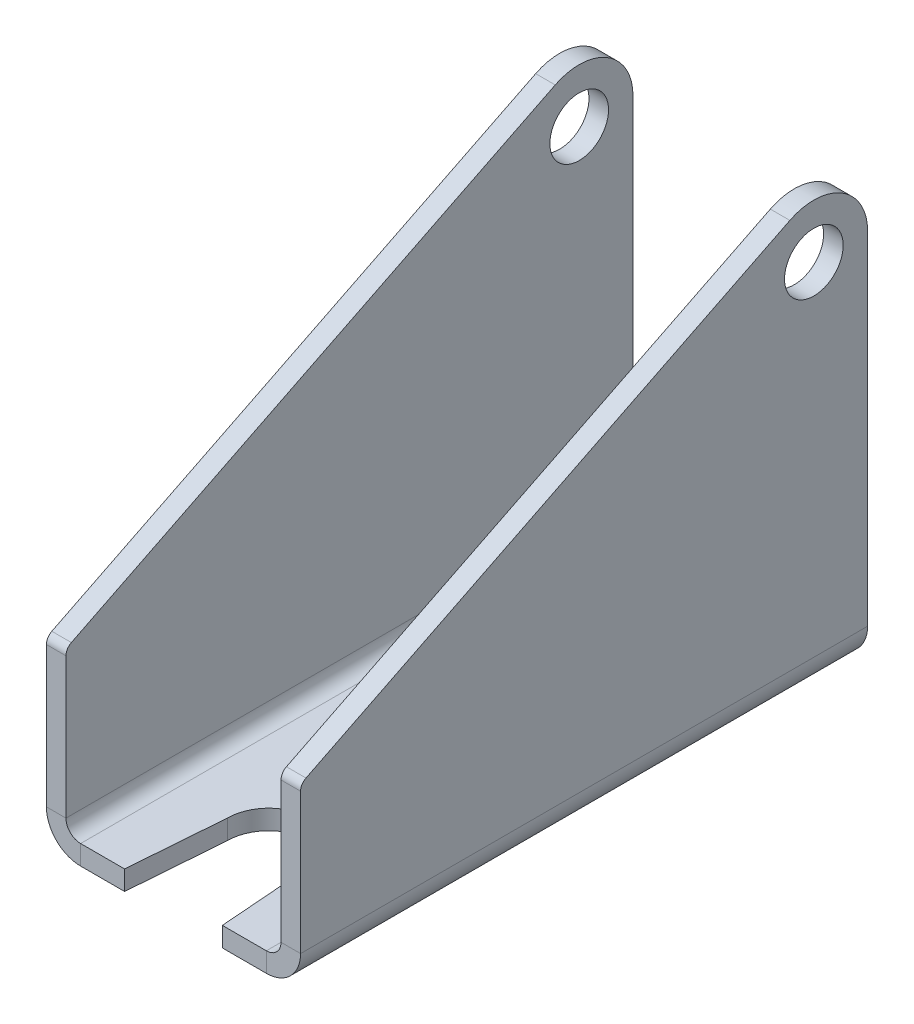
ISO-10303-21;
HEADER;
FILE_DESCRIPTION(('STEP AP214'),'2;1');
FILE_NAME('part.step','',(''),(''),'','','');
FILE_SCHEMA(('AUTOMOTIVE_DESIGN { 1 0 10303 214 1 1 1 1 }'));
ENDSEC;
DATA;
#1=APPLICATION_CONTEXT('core data for automotive mechanical design processes');
#2=APPLICATION_PROTOCOL_DEFINITION('international standard','automotive_design',2000,#1);
#3=PRODUCT_CONTEXT('',#1,'mechanical');
#4=PRODUCT('Part','Part','',(#3));
#5=PRODUCT_RELATED_PRODUCT_CATEGORY('part','',(#4));
#6=PRODUCT_DEFINITION_FORMATION('','',#4);
#7=PRODUCT_DEFINITION_CONTEXT('part definition',#1,'design');
#8=PRODUCT_DEFINITION('design','',#6,#7);
#9=PRODUCT_DEFINITION_SHAPE('','',#8);
#10=(LENGTH_UNIT() NAMED_UNIT(*) SI_UNIT(.MILLI.,.METRE.));
#11=(NAMED_UNIT(*) PLANE_ANGLE_UNIT() SI_UNIT($,.RADIAN.));
#12=(NAMED_UNIT(*) SI_UNIT($,.STERADIAN.) SOLID_ANGLE_UNIT());
#13=UNCERTAINTY_MEASURE_WITH_UNIT(LENGTH_MEASURE(1.E-05),#10,'distance_accuracy_value','');
#14=(GEOMETRIC_REPRESENTATION_CONTEXT(3) GLOBAL_UNCERTAINTY_ASSIGNED_CONTEXT((#13)) GLOBAL_UNIT_ASSIGNED_CONTEXT((#10,
#11,#12)) REPRESENTATION_CONTEXT('',''));
#15=CARTESIAN_POINT('',(0.,0.,0.));
#16=DIRECTION('',(0.,0.,1.));
#17=DIRECTION('',(1.,0.,0.));
#18=AXIS2_PLACEMENT_3D('',#15,#16,#17);
#19=CARTESIAN_POINT('',(0.,-2.,0.));
#20=DIRECTION('',(0.,0.,1.));
#21=DIRECTION('',(1.,0.,0.));
#22=AXIS2_PLACEMENT_3D('',#19,#20,#21);
#23=PLANE('',#22);
#24=DIRECTION('',(0.,-1.,0.));
#25=VECTOR('',#24,1.);
#26=CARTESIAN_POINT('',(-16.,-2.,0.));
#27=LINE('',#26,#25);
#28=CARTESIAN_POINT('',(-16.,0.,0.));
#29=VERTEX_POINT('',#28);
#30=CARTESIAN_POINT('',(-16.,-2.,0.));
#31=VERTEX_POINT('',#30);
#32=EDGE_CURVE('E77',#29,#31,#27,.T.);
#33=ORIENTED_EDGE('',*,*,#32,.F.);
#34=DIRECTION('',(1.,0.,0.));
#35=VECTOR('',#34,1.);
#36=CARTESIAN_POINT('',(0.,0.,0.));
#37=LINE('',#36,#35);
#38=CARTESIAN_POINT('',(-20.5,0.,0.));
#39=VERTEX_POINT('',#38);
#40=EDGE_CURVE('E363',#39,#29,#37,.T.);
#41=ORIENTED_EDGE('',*,*,#40,.F.);
#42=DIRECTION('',(0.,-1.,0.));
#43=VECTOR('',#42,1.);
#44=CARTESIAN_POINT('',(-20.5,0.,0.));
#45=LINE('',#44,#43);
#46=CARTESIAN_POINT('',(-20.5,-2.,0.));
#47=VERTEX_POINT('',#46);
#48=EDGE_CURVE('E343',#39,#47,#45,.T.);
#49=ORIENTED_EDGE('',*,*,#48,.T.);
#50=DIRECTION('',(1.,0.,0.));
#51=VECTOR('',#50,1.);
#52=CARTESIAN_POINT('',(-16.,-2.,0.));
#53=LINE('',#52,#51);
#54=EDGE_CURVE('E364',#47,#31,#53,.T.);
#55=ORIENTED_EDGE('',*,*,#54,.T.);
#56=EDGE_LOOP('',(#33,#41,#49,#55));
#57=FACE_BOUND('',#56,.T.);
#58=ADVANCED_FACE('F68',(#57),#23,.T.);
#59=CARTESIAN_POINT('',(-24.,0.,0.));
#60=DIRECTION('',(1.,0.,0.));
#61=DIRECTION('',(0.,1.,0.));
#62=AXIS2_PLACEMENT_3D('',#59,#60,#61);
#63=PLANE('',#62);
#64=CARTESIAN_POINT('',(-24.0000000000001,36.5,-52.5));
#65=DIRECTION('',(-1.,0.,0.));
#66=DIRECTION('',(0.,-1.,0.));
#67=AXIS2_PLACEMENT_3D('',#64,#65,#66);
#68=CIRCLE('',#67,3.);
#69=CARTESIAN_POINT('',(-24.0000000000001,33.5,-52.5));
#70=VERTEX_POINT('',#69);
#71=EDGE_CURVE('E236',#70,#70,#68,.T.);
#72=ORIENTED_EDGE('',*,*,#71,.F.);
#73=EDGE_LOOP('',(#72));
#74=FACE_BOUND('',#73,.T.);
#75=DIRECTION('',(0.,1.,0.));
#76=VECTOR('',#75,1.);
#77=CARTESIAN_POINT('',(-24.0000000000001,42.,0.));
#78=LINE('',#77,#76);
#79=CARTESIAN_POINT('',(-24.,1.49999999999999,0.));
#80=VERTEX_POINT('',#79);
#81=CARTESIAN_POINT('',(-24.0000000000001,15.8808509828625,0.));
#82=VERTEX_POINT('',#81);
#83=EDGE_CURVE('E326',#80,#82,#78,.T.);
#84=ORIENTED_EDGE('',*,*,#83,.T.);
#85=CARTESIAN_POINT('',(-24.0000000000001,15.8808509828624,-1.));
#86=DIRECTION('',(1.,0.,0.));
#87=DIRECTION('',(0.,1.,0.));
#88=AXIS2_PLACEMENT_3D('',#85,#86,#87);
#89=CIRCLE('',#88,1.);
#90=CARTESIAN_POINT('',(-24.0000000000001,16.7759983118712,-0.554229588949058));
#91=VERTEX_POINT('',#90);
#92=EDGE_CURVE('E380',#82,#91,#89,.F.);
#93=ORIENTED_EDGE('',*,*,#92,.T.);
#94=DIRECTION('',(0.,0.445770411050947,-0.895147329008734));
#95=VECTOR('',#94,1.);
#96=CARTESIAN_POINT('',(-24.,13.2212642204192,6.5839981812558));
#97=LINE('',#96,#95);
#98=CARTESIAN_POINT('',(-24.0000000000001,41.423310309548,-50.0482627392198));
#99=VERTEX_POINT('',#98);
#100=EDGE_CURVE('E251',#91,#99,#97,.T.);
#101=ORIENTED_EDGE('',*,*,#100,.T.);
#102=CARTESIAN_POINT('',(-24.0000000000001,36.5,-52.5));
#103=DIRECTION('',(-1.,0.,0.));
#104=DIRECTION('',(0.,-1.,0.));
#105=AXIS2_PLACEMENT_3D('',#102,#103,#104);
#106=CIRCLE('',#105,5.50000000000001);
#107=CARTESIAN_POINT('',(-24.0000000000001,36.5,-58.));
#108=VERTEX_POINT('',#107);
#109=EDGE_CURVE('E249',#99,#108,#106,.T.);
#110=ORIENTED_EDGE('',*,*,#109,.T.);
#111=DIRECTION('',(0.,-1.,0.));
#112=VECTOR('',#111,1.);
#113=CARTESIAN_POINT('',(-24.,0.,-58.));
#114=LINE('',#113,#112);
#115=CARTESIAN_POINT('',(-24.,1.49999999999999,-58.));
#116=VERTEX_POINT('',#115);
#117=EDGE_CURVE('E329',#108,#116,#114,.T.);
#118=ORIENTED_EDGE('',*,*,#117,.T.);
#119=DIRECTION('',(0.,0.,-1.));
#120=VECTOR('',#119,1.);
#121=CARTESIAN_POINT('',(-24.,1.49999999999999,0.));
#122=LINE('',#121,#120);
#123=EDGE_CURVE('E320',#80,#116,#122,.T.);
#124=ORIENTED_EDGE('',*,*,#123,.F.);
#125=EDGE_LOOP('',(#84,#93,#101,#110,#118,#124));
#126=FACE_BOUND('',#125,.T.);
#127=ADVANCED_FACE('F466',(#74,#126),#63,.F.);
#128=CARTESIAN_POINT('',(-22.,0.,0.));
#129=DIRECTION('',(1.,0.,0.));
#130=DIRECTION('',(0.,1.,0.));
#131=AXIS2_PLACEMENT_3D('',#128,#129,#130);
#132=PLANE('',#131);
#133=CARTESIAN_POINT('',(-22.0000000000001,36.5,-52.5));
#134=DIRECTION('',(1.,0.,0.));
#135=DIRECTION('',(0.,1.,0.));
#136=AXIS2_PLACEMENT_3D('',#133,#134,#135);
#137=CIRCLE('',#136,3.);
#138=CARTESIAN_POINT('',(-22.0000000000001,39.5,-52.5));
#139=VERTEX_POINT('',#138);
#140=EDGE_CURVE('E246',#139,#139,#137,.T.);
#141=ORIENTED_EDGE('',*,*,#140,.F.);
#142=EDGE_LOOP('',(#141));
#143=FACE_BOUND('',#142,.T.);
#144=DIRECTION('',(0.,-0.445770411050947,0.895147329008734));
#145=VECTOR('',#144,1.);
#146=CARTESIAN_POINT('',(-22.,13.2212642204192,6.5839981812558));
#147=LINE('',#146,#145);
#148=CARTESIAN_POINT('',(-22.0000000000001,41.423310309548,-50.0482627392198));
#149=VERTEX_POINT('',#148);
#150=CARTESIAN_POINT('',(-22.0000000000001,16.7759983118712,-0.554229588949059));
#151=VERTEX_POINT('',#150);
#152=EDGE_CURVE('E266',#149,#151,#147,.T.);
#153=ORIENTED_EDGE('',*,*,#152,.T.);
#154=CARTESIAN_POINT('',(-22.0000000000001,15.8808509828625,-1.));
#155=DIRECTION('',(1.,0.,0.));
#156=DIRECTION('',(0.,1.,0.));
#157=AXIS2_PLACEMENT_3D('',#154,#155,#156);
#158=CIRCLE('',#157,1.);
#159=CARTESIAN_POINT('',(-22.0000000000001,15.8808509828625,0.));
#160=VERTEX_POINT('',#159);
#161=EDGE_CURVE('E384',#151,#160,#158,.T.);
#162=ORIENTED_EDGE('',*,*,#161,.T.);
#163=DIRECTION('',(0.,1.,0.));
#164=VECTOR('',#163,1.);
#165=CARTESIAN_POINT('',(-22.0000000000001,42.,0.));
#166=LINE('',#165,#164);
#167=CARTESIAN_POINT('',(-22.,1.49999999999999,0.));
#168=VERTEX_POINT('',#167);
#169=EDGE_CURVE('E325',#168,#160,#166,.T.);
#170=ORIENTED_EDGE('',*,*,#169,.F.);
#171=DIRECTION('',(0.,0.,1.));
#172=VECTOR('',#171,1.);
#173=CARTESIAN_POINT('',(-22.,1.49999999999999,-58.));
#174=LINE('',#173,#172);
#175=CARTESIAN_POINT('',(-22.,1.49999999999999,-58.));
#176=VERTEX_POINT('',#175);
#177=EDGE_CURVE('E315',#176,#168,#174,.T.);
#178=ORIENTED_EDGE('',*,*,#177,.F.);
#179=DIRECTION('',(0.,-1.,0.));
#180=VECTOR('',#179,1.);
#181=CARTESIAN_POINT('',(-22.,0.,-58.));
#182=LINE('',#181,#180);
#183=CARTESIAN_POINT('',(-22.0000000000001,36.5,-58.));
#184=VERTEX_POINT('',#183);
#185=EDGE_CURVE('E330',#184,#176,#182,.T.);
#186=ORIENTED_EDGE('',*,*,#185,.F.);
#187=CARTESIAN_POINT('',(-22.0000000000001,36.5,-52.5));
#188=DIRECTION('',(1.,0.,0.));
#189=DIRECTION('',(0.,1.,0.));
#190=AXIS2_PLACEMENT_3D('',#187,#188,#189);
#191=CIRCLE('',#190,5.50000000000001);
#192=EDGE_CURVE('E261',#184,#149,#191,.T.);
#193=ORIENTED_EDGE('',*,*,#192,.T.);
#194=EDGE_LOOP('',(#153,#162,#170,#178,#186,#193));
#195=FACE_BOUND('',#194,.T.);
#196=ADVANCED_FACE('F455',(#143,#195),#132,.T.);
#197=CARTESIAN_POINT('',(2.,0.,0.));
#198=DIRECTION('',(-1.,0.,0.));
#199=DIRECTION('',(0.,-1.,0.));
#200=AXIS2_PLACEMENT_3D('',#197,#198,#199);
#201=PLANE('',#200);
#202=CARTESIAN_POINT('',(2.00000000000013,36.5000000000001,-52.5));
#203=DIRECTION('',(-1.,0.,0.));
#204=DIRECTION('',(0.,-1.,0.));
#205=AXIS2_PLACEMENT_3D('',#202,#203,#204);
#206=CIRCLE('',#205,3.);
#207=CARTESIAN_POINT('',(2.00000000000012,33.5000000000001,-52.5));
#208=VERTEX_POINT('',#207);
#209=EDGE_CURVE('E243',#208,#208,#206,.T.);
#210=ORIENTED_EDGE('',*,*,#209,.T.);
#211=EDGE_LOOP('',(#210));
#212=FACE_BOUND('',#211,.T.);
#213=DIRECTION('',(0.,0.445770411050947,-0.895147329008734));
#214=VECTOR('',#213,1.);
#215=CARTESIAN_POINT('',(2.00000000000005,13.2212642204193,6.5839981812558));
#216=LINE('',#215,#214);
#217=CARTESIAN_POINT('',(2.00000000000006,16.7759983118713,-0.554229588949056));
#218=VERTEX_POINT('',#217);
#219=CARTESIAN_POINT('',(2.0000000000001,41.4233103095481,-50.0482627392198));
#220=VERTEX_POINT('',#219);
#221=EDGE_CURVE('E264',#218,#220,#216,.T.);
#222=ORIENTED_EDGE('',*,*,#221,.F.);
#223=CARTESIAN_POINT('',(2.00000000000006,15.8808509828625,-1.));
#224=DIRECTION('',(-1.,0.,0.));
#225=DIRECTION('',(0.,-1.,0.));
#226=AXIS2_PLACEMENT_3D('',#223,#224,#225);
#227=CIRCLE('',#226,1.);
#228=CARTESIAN_POINT('',(2.00000000000006,15.8808509828625,0.));
#229=VERTEX_POINT('',#228);
#230=EDGE_CURVE('E392',#218,#229,#227,.F.);
#231=ORIENTED_EDGE('',*,*,#230,.T.);
#232=DIRECTION('',(0.,-1.,0.));
#233=VECTOR('',#232,1.);
#234=CARTESIAN_POINT('',(2.,0.,0.));
#235=LINE('',#234,#233);
#236=CARTESIAN_POINT('',(2.00000000000001,1.49999999999999,0.));
#237=VERTEX_POINT('',#236);
#238=EDGE_CURVE('E284',#229,#237,#235,.T.);
#239=ORIENTED_EDGE('',*,*,#238,.T.);
#240=DIRECTION('',(0.,0.,1.));
#241=VECTOR('',#240,1.);
#242=CARTESIAN_POINT('',(2.00000000000001,1.49999999999999,0.));
#243=LINE('',#242,#241);
#244=CARTESIAN_POINT('',(2.00000000000001,1.49999999999999,-58.));
#245=VERTEX_POINT('',#244);
#246=EDGE_CURVE('E275',#245,#237,#243,.T.);
#247=ORIENTED_EDGE('',*,*,#246,.F.);
#248=DIRECTION('',(0.,1.,0.));
#249=VECTOR('',#248,1.);
#250=CARTESIAN_POINT('',(2.00000000000015,42.,-58.));
#251=LINE('',#250,#249);
#252=CARTESIAN_POINT('',(2.00000000000007,36.5000000000001,-58.));
#253=VERTEX_POINT('',#252);
#254=EDGE_CURVE('E281',#245,#253,#251,.T.);
#255=ORIENTED_EDGE('',*,*,#254,.T.);
#256=CARTESIAN_POINT('',(2.00000000000013,36.5000000000001,-52.5));
#257=DIRECTION('',(-1.,0.,0.));
#258=DIRECTION('',(0.,-1.,0.));
#259=AXIS2_PLACEMENT_3D('',#256,#257,#258);
#260=CIRCLE('',#259,5.50000000000001);
#261=EDGE_CURVE('E259',#220,#253,#260,.T.);
#262=ORIENTED_EDGE('',*,*,#261,.F.);
#263=EDGE_LOOP('',(#222,#231,#239,#247,#255,#262));
#264=FACE_BOUND('',#263,.T.);
#265=ADVANCED_FACE('F433',(#212,#264),#201,.F.);
#266=CARTESIAN_POINT('',(0.,0.,0.));
#267=DIRECTION('',(-1.,0.,0.));
#268=DIRECTION('',(0.,-1.,0.));
#269=AXIS2_PLACEMENT_3D('',#266,#267,#268);
#270=PLANE('',#269);
#271=CARTESIAN_POINT('',(1.28369537222284E-13,36.5000000000001,-52.5));
#272=DIRECTION('',(-1.,0.,0.));
#273=DIRECTION('',(0.,-1.,0.));
#274=AXIS2_PLACEMENT_3D('',#271,#272,#273);
#275=CIRCLE('',#274,3.);
#276=CARTESIAN_POINT('',(1.17895093205754E-13,33.5000000000001,-52.5));
#277=VERTEX_POINT('',#276);
#278=EDGE_CURVE('E242',#277,#277,#275,.T.);
#279=ORIENTED_EDGE('',*,*,#278,.F.);
#280=EDGE_LOOP('',(#279));
#281=FACE_BOUND('',#280,.T.);
#282=DIRECTION('',(0.,-1.,0.));
#283=VECTOR('',#282,1.);
#284=CARTESIAN_POINT('',(0.,0.,0.));
#285=LINE('',#284,#283);
#286=CARTESIAN_POINT('',(0.,15.8808509828625,0.));
#287=VERTEX_POINT('',#286);
#288=CARTESIAN_POINT('',(0.,1.49999999999999,0.));
#289=VERTEX_POINT('',#288);
#290=EDGE_CURVE('E285',#287,#289,#285,.T.);
#291=ORIENTED_EDGE('',*,*,#290,.F.);
#292=CARTESIAN_POINT('',(0.,15.8808509828625,-1.));
#293=DIRECTION('',(-1.,0.,0.));
#294=DIRECTION('',(0.,-1.,0.));
#295=AXIS2_PLACEMENT_3D('',#292,#293,#294);
#296=CIRCLE('',#295,1.);
#297=CARTESIAN_POINT('',(0.,16.7759983118713,-0.554229588949056));
#298=VERTEX_POINT('',#297);
#299=EDGE_CURVE('E389',#287,#298,#296,.T.);
#300=ORIENTED_EDGE('',*,*,#299,.T.);
#301=DIRECTION('',(0.,0.445770411050947,-0.895147329008734));
#302=VECTOR('',#301,1.);
#303=CARTESIAN_POINT('',(0.,13.2212642204193,6.5839981812558));
#304=LINE('',#303,#302);
#305=CARTESIAN_POINT('',(1.00613961606655E-13,41.4233103095481,-50.0482627392198));
#306=VERTEX_POINT('',#305);
#307=EDGE_CURVE('E366',#298,#306,#304,.T.);
#308=ORIENTED_EDGE('',*,*,#307,.T.);
#309=CARTESIAN_POINT('',(1.28369537222284E-13,36.5000000000001,-52.5));
#310=DIRECTION('',(-1.,0.,0.));
#311=DIRECTION('',(0.,-1.,0.));
#312=AXIS2_PLACEMENT_3D('',#309,#310,#311);
#313=CIRCLE('',#312,5.50000000000001);
#314=CARTESIAN_POINT('',(0.,36.5000000000001,-58.));
#315=VERTEX_POINT('',#314);
#316=EDGE_CURVE('E257',#306,#315,#313,.T.);
#317=ORIENTED_EDGE('',*,*,#316,.T.);
#318=DIRECTION('',(0.,1.,0.));
#319=VECTOR('',#318,1.);
#320=CARTESIAN_POINT('',(1.46642216231412E-13,42.,-58.));
#321=LINE('',#320,#319);
#322=CARTESIAN_POINT('',(0.,1.49999999999999,-58.));
#323=VERTEX_POINT('',#322);
#324=EDGE_CURVE('E280',#323,#315,#321,.T.);
#325=ORIENTED_EDGE('',*,*,#324,.F.);
#326=DIRECTION('',(0.,0.,-1.));
#327=VECTOR('',#326,1.);
#328=CARTESIAN_POINT('',(0.,1.49999999999999,0.));
#329=LINE('',#328,#327);
#330=EDGE_CURVE('E270',#289,#323,#329,.T.);
#331=ORIENTED_EDGE('',*,*,#330,.F.);
#332=EDGE_LOOP('',(#291,#300,#308,#317,#325,#331));
#333=FACE_BOUND('',#332,.T.);
#334=ADVANCED_FACE('F420',(#281,#333),#270,.T.);
#335=CARTESIAN_POINT('',(-24.,0.,-58.));
#336=DIRECTION('',(0.,0.,1.));
#337=DIRECTION('',(1.,0.,0.));
#338=AXIS2_PLACEMENT_3D('',#335,#336,#337);
#339=PLANE('',#338);
#340=DIRECTION('',(-1.,0.,0.));
#341=VECTOR('',#340,1.);
#342=CARTESIAN_POINT('',(25.9999999999999,36.5000000000002,-58.));
#343=LINE('',#342,#341);
#344=EDGE_CURVE('E239',#184,#108,#343,.T.);
#345=ORIENTED_EDGE('',*,*,#344,.F.);
#346=ORIENTED_EDGE('',*,*,#185,.T.);
#347=DIRECTION('',(-1.,0.,0.));
#348=VECTOR('',#347,1.);
#349=CARTESIAN_POINT('',(-22.,1.49999999999999,-58.));
#350=LINE('',#349,#348);
#351=EDGE_CURVE('E312',#176,#116,#350,.T.);
#352=ORIENTED_EDGE('',*,*,#351,.T.);
#353=ORIENTED_EDGE('',*,*,#117,.F.);
#354=EDGE_LOOP('',(#345,#346,#352,#353));
#355=FACE_BOUND('',#354,.T.);
#356=ADVANCED_FACE('F483',(#355),#339,.F.);
#357=CARTESIAN_POINT('',(2.00000000000015,42.,-58.));
#358=DIRECTION('',(0.,0.,1.));
#359=DIRECTION('',(1.,0.,0.));
#360=AXIS2_PLACEMENT_3D('',#357,#358,#359);
#361=PLANE('',#360);
#362=DIRECTION('',(-1.,0.,0.));
#363=VECTOR('',#362,1.);
#364=CARTESIAN_POINT('',(25.9999999999999,36.5000000000002,-58.));
#365=LINE('',#364,#363);
#366=EDGE_CURVE('E372',#253,#315,#365,.T.);
#367=ORIENTED_EDGE('',*,*,#366,.F.);
#368=ORIENTED_EDGE('',*,*,#254,.F.);
#369=DIRECTION('',(1.,0.,0.));
#370=VECTOR('',#369,1.);
#371=CARTESIAN_POINT('',(0.,1.49999999999999,-58.));
#372=LINE('',#371,#370);
#373=EDGE_CURVE('E272',#323,#245,#372,.T.);
#374=ORIENTED_EDGE('',*,*,#373,.F.);
#375=ORIENTED_EDGE('',*,*,#324,.T.);
#376=EDGE_LOOP('',(#367,#368,#374,#375));
#377=FACE_BOUND('',#376,.T.);
#378=ADVANCED_FACE('F430',(#377),#361,.F.);
#379=CARTESIAN_POINT('',(-24.0000000000001,42.,0.));
#380=DIRECTION('',(0.,0.,-1.));
#381=DIRECTION('',(-1.,0.,0.));
#382=AXIS2_PLACEMENT_3D('',#379,#380,#381);
#383=PLANE('',#382);
#384=ORIENTED_EDGE('',*,*,#169,.T.);
#385=DIRECTION('',(-1.,0.,0.));
#386=VECTOR('',#385,1.);
#387=CARTESIAN_POINT('',(-24.0000000000001,15.8808509828624,0.));
#388=LINE('',#387,#386);
#389=EDGE_CURVE('E375',#160,#82,#388,.T.);
#390=ORIENTED_EDGE('',*,*,#389,.T.);
#391=ORIENTED_EDGE('',*,*,#83,.F.);
#392=DIRECTION('',(-1.,0.,0.));
#393=VECTOR('',#392,1.);
#394=CARTESIAN_POINT('',(-22.,1.49999999999999,0.));
#395=LINE('',#394,#393);
#396=EDGE_CURVE('E317',#168,#80,#395,.T.);
#397=ORIENTED_EDGE('',*,*,#396,.F.);
#398=EDGE_LOOP('',(#384,#390,#391,#397));
#399=FACE_BOUND('',#398,.T.);
#400=ADVANCED_FACE('F459',(#399),#383,.F.);
#401=CARTESIAN_POINT('',(2.,0.,0.));
#402=DIRECTION('',(0.,0.,-1.));
#403=DIRECTION('',(-1.,0.,0.));
#404=AXIS2_PLACEMENT_3D('',#401,#402,#403);
#405=PLANE('',#404);
#406=ORIENTED_EDGE('',*,*,#238,.F.);
#407=DIRECTION('',(-1.,0.,0.));
#408=VECTOR('',#407,1.);
#409=CARTESIAN_POINT('',(1.02782365951626E-13,15.8808509828625,0.));
#410=LINE('',#409,#408);
#411=EDGE_CURVE('E386',#229,#287,#410,.T.);
#412=ORIENTED_EDGE('',*,*,#411,.T.);
#413=ORIENTED_EDGE('',*,*,#290,.T.);
#414=DIRECTION('',(1.,0.,0.));
#415=VECTOR('',#414,1.);
#416=CARTESIAN_POINT('',(0.,1.49999999999999,0.));
#417=LINE('',#416,#415);
#418=EDGE_CURVE('E269',#289,#237,#417,.T.);
#419=ORIENTED_EDGE('',*,*,#418,.T.);
#420=EDGE_LOOP('',(#406,#412,#413,#419));
#421=FACE_BOUND('',#420,.T.);
#422=ADVANCED_FACE('F416',(#421),#405,.F.);
#423=CARTESIAN_POINT('',(0.,-2.,0.));
#424=DIRECTION('',(0.,1.,0.));
#425=DIRECTION('',(0.,0.,1.));
#426=AXIS2_PLACEMENT_3D('',#423,#424,#425);
#427=PLANE('',#426);
#428=CARTESIAN_POINT('',(-11.,-2.,-45.75));
#429=DIRECTION('',(0.,-1.,0.));
#430=DIRECTION('',(0.,0.,-1.));
#431=AXIS2_PLACEMENT_3D('',#428,#429,#430);
#432=CIRCLE('',#431,4.25000000000001);
#433=CARTESIAN_POINT('',(-11.,-2.,-50.));
#434=VERTEX_POINT('',#433);
#435=EDGE_CURVE('E226',#434,#434,#432,.T.);
#436=ORIENTED_EDGE('',*,*,#435,.F.);
#437=EDGE_LOOP('',(#436));
#438=FACE_BOUND('',#437,.T.);
#439=CARTESIAN_POINT('',(-11.,-2.,-9.75));
#440=DIRECTION('',(0.,-1.,0.));
#441=DIRECTION('',(0.,0.,-1.));
#442=AXIS2_PLACEMENT_3D('',#439,#440,#441);
#443=CIRCLE('',#442,4.25);
#444=CARTESIAN_POINT('',(-15.25,-2.,-9.75));
#445=VERTEX_POINT('',#444);
#446=CARTESIAN_POINT('',(-6.75,-2.,-9.75));
#447=VERTEX_POINT('',#446);
#448=EDGE_CURVE('E211',#445,#447,#443,.T.);
#449=ORIENTED_EDGE('',*,*,#448,.F.);
#450=DIRECTION('',(0.0766964988847364,0.,-0.997054485501582));
#451=VECTOR('',#450,1.);
#452=CARTESIAN_POINT('',(-15.25,-2.,-9.75));
#453=LINE('',#452,#451);
#454=EDGE_CURVE('E218',#31,#445,#453,.T.);
#455=ORIENTED_EDGE('',*,*,#454,.F.);
#456=ORIENTED_EDGE('',*,*,#54,.F.);
#457=DIRECTION('',(0.,0.,1.));
#458=VECTOR('',#457,1.);
#459=CARTESIAN_POINT('',(-20.5,-2.,0.));
#460=LINE('',#459,#458);
#461=CARTESIAN_POINT('',(-20.5,-2.,-58.));
#462=VERTEX_POINT('',#461);
#463=EDGE_CURVE('E336',#47,#462,#460,.F.);
#464=ORIENTED_EDGE('',*,*,#463,.T.);
#465=DIRECTION('',(-1.,0.,0.));
#466=VECTOR('',#465,1.);
#467=CARTESIAN_POINT('',(0.,-2.,-58.));
#468=LINE('',#467,#466);
#469=CARTESIAN_POINT('',(-1.5,-2.,-58.));
#470=VERTEX_POINT('',#469);
#471=EDGE_CURVE('E360',#470,#462,#468,.T.);
#472=ORIENTED_EDGE('',*,*,#471,.F.);
#473=DIRECTION('',(0.,0.,-1.));
#474=VECTOR('',#473,1.);
#475=CARTESIAN_POINT('',(-1.5,-2.,-58.));
#476=LINE('',#475,#474);
#477=CARTESIAN_POINT('',(-1.5,-2.,0.));
#478=VERTEX_POINT('',#477);
#479=EDGE_CURVE('E291',#470,#478,#476,.F.);
#480=ORIENTED_EDGE('',*,*,#479,.T.);
#481=CARTESIAN_POINT('',(-5.99999999999999,-2.,0.));
#482=VERTEX_POINT('',#481);
#483=EDGE_CURVE('E362',#482,#478,#53,.T.);
#484=ORIENTED_EDGE('',*,*,#483,.F.);
#485=DIRECTION('',(0.0766964988847376,0.,0.997054485501582));
#486=VECTOR('',#485,1.);
#487=CARTESIAN_POINT('',(-5.99999999999999,-2.,0.));
#488=LINE('',#487,#486);
#489=EDGE_CURVE('E84',#447,#482,#488,.T.);
#490=ORIENTED_EDGE('',*,*,#489,.F.);
#491=EDGE_LOOP('',(#449,#455,#456,#464,#472,#480,#484,#490));
#492=FACE_BOUND('',#491,.T.);
#493=ADVANCED_FACE('F224',(#438,#492),#427,.F.);
#494=CARTESIAN_POINT('',(0.,0.,0.));
#495=DIRECTION('',(0.,1.,0.));
#496=DIRECTION('',(0.,0.,1.));
#497=AXIS2_PLACEMENT_3D('',#494,#495,#496);
#498=PLANE('',#497);
#499=CARTESIAN_POINT('',(-11.,0.,-45.75));
#500=DIRECTION('',(0.,1.,0.));
#501=DIRECTION('',(0.,0.,1.));
#502=AXIS2_PLACEMENT_3D('',#499,#500,#501);
#503=CIRCLE('',#502,4.25000000000001);
#504=CARTESIAN_POINT('',(-11.,0.,-41.5));
#505=VERTEX_POINT('',#504);
#506=EDGE_CURVE('E72',#505,#505,#503,.T.);
#507=ORIENTED_EDGE('',*,*,#506,.F.);
#508=EDGE_LOOP('',(#507));
#509=FACE_BOUND('',#508,.T.);
#510=DIRECTION('',(-0.0766964988847364,0.,0.997054485501582));
#511=VECTOR('',#510,1.);
#512=CARTESIAN_POINT('',(-15.9058823529412,0.,-1.2235294117647));
#513=LINE('',#512,#511);
#514=CARTESIAN_POINT('',(-15.25,0.,-9.75));
#515=VERTEX_POINT('',#514);
#516=EDGE_CURVE('E234',#515,#29,#513,.T.);
#517=ORIENTED_EDGE('',*,*,#516,.F.);
#518=CARTESIAN_POINT('',(-11.,0.,-9.75));
#519=DIRECTION('',(0.,1.,0.));
#520=DIRECTION('',(0.,0.,1.));
#521=AXIS2_PLACEMENT_3D('',#518,#519,#520);
#522=CIRCLE('',#521,4.25);
#523=CARTESIAN_POINT('',(-6.75,0.,-9.75));
#524=VERTEX_POINT('',#523);
#525=EDGE_CURVE('E12',#524,#515,#522,.T.);
#526=ORIENTED_EDGE('',*,*,#525,.F.);
#527=DIRECTION('',(-0.0766964988847376,0.,-0.997054485501582));
#528=VECTOR('',#527,1.);
#529=CARTESIAN_POINT('',(-5.96470588235293,0.,0.458823529411768));
#530=LINE('',#529,#528);
#531=CARTESIAN_POINT('',(-5.99999999999999,0.,0.));
#532=VERTEX_POINT('',#531);
#533=EDGE_CURVE('E229',#532,#524,#530,.T.);
#534=ORIENTED_EDGE('',*,*,#533,.F.);
#535=CARTESIAN_POINT('',(-1.5,0.,0.));
#536=VERTEX_POINT('',#535);
#537=EDGE_CURVE('E368',#532,#536,#37,.T.);
#538=ORIENTED_EDGE('',*,*,#537,.T.);
#539=DIRECTION('',(0.,0.,-1.));
#540=VECTOR('',#539,1.);
#541=CARTESIAN_POINT('',(-1.5,0.,-58.));
#542=LINE('',#541,#540);
#543=CARTESIAN_POINT('',(-1.5,0.,-58.));
#544=VERTEX_POINT('',#543);
#545=EDGE_CURVE('E304',#544,#536,#542,.F.);
#546=ORIENTED_EDGE('',*,*,#545,.F.);
#547=DIRECTION('',(-1.,0.,0.));
#548=VECTOR('',#547,1.);
#549=CARTESIAN_POINT('',(0.,0.,-58.));
#550=LINE('',#549,#548);
#551=CARTESIAN_POINT('',(-20.5,0.,-58.));
#552=VERTEX_POINT('',#551);
#553=EDGE_CURVE('E357',#544,#552,#550,.T.);
#554=ORIENTED_EDGE('',*,*,#553,.T.);
#555=DIRECTION('',(0.,0.,1.));
#556=VECTOR('',#555,1.);
#557=CARTESIAN_POINT('',(-20.5,0.,0.));
#558=LINE('',#557,#556);
#559=EDGE_CURVE('E349',#39,#552,#558,.F.);
#560=ORIENTED_EDGE('',*,*,#559,.F.);
#561=ORIENTED_EDGE('',*,*,#40,.T.);
#562=EDGE_LOOP('',(#517,#526,#534,#538,#546,#554,#560,#561));
#563=FACE_BOUND('',#562,.T.);
#564=ADVANCED_FACE('F401',(#509,#563),#498,.T.);
#565=CARTESIAN_POINT('',(0.,-2.,-58.));
#566=DIRECTION('',(0.,0.,-1.));
#567=DIRECTION('',(-1.,0.,0.));
#568=AXIS2_PLACEMENT_3D('',#565,#566,#567);
#569=PLANE('',#568);
#570=ORIENTED_EDGE('',*,*,#553,.F.);
#571=DIRECTION('',(0.,-1.,0.));
#572=VECTOR('',#571,1.);
#573=CARTESIAN_POINT('',(-1.5,0.,-58.));
#574=LINE('',#573,#572);
#575=EDGE_CURVE('E298',#544,#470,#574,.T.);
#576=ORIENTED_EDGE('',*,*,#575,.T.);
#577=ORIENTED_EDGE('',*,*,#471,.T.);
#578=DIRECTION('',(0.,-1.,0.));
#579=VECTOR('',#578,1.);
#580=CARTESIAN_POINT('',(-20.5,0.,-58.));
#581=LINE('',#580,#579);
#582=EDGE_CURVE('E354',#552,#462,#581,.T.);
#583=ORIENTED_EDGE('',*,*,#582,.F.);
#584=EDGE_LOOP('',(#570,#576,#577,#583));
#585=FACE_BOUND('',#584,.T.);
#586=ADVANCED_FACE('F440',(#585),#569,.T.);
#587=DIRECTION('',(0.,1.,0.));
#588=VECTOR('',#587,1.);
#589=CARTESIAN_POINT('',(-5.99999999999999,-2.,0.));
#590=LINE('',#589,#588);
#591=EDGE_CURVE('E394',#482,#532,#590,.T.);
#592=ORIENTED_EDGE('',*,*,#591,.F.);
#593=ORIENTED_EDGE('',*,*,#483,.T.);
#594=DIRECTION('',(0.,-1.,0.));
#595=VECTOR('',#594,1.);
#596=CARTESIAN_POINT('',(-1.5,0.,0.));
#597=LINE('',#596,#595);
#598=EDGE_CURVE('E309',#536,#478,#597,.T.);
#599=ORIENTED_EDGE('',*,*,#598,.F.);
#600=ORIENTED_EDGE('',*,*,#537,.F.);
#601=EDGE_LOOP('',(#592,#593,#599,#600));
#602=FACE_BOUND('',#601,.T.);
#603=ADVANCED_FACE('F403',(#602),#23,.T.);
#604=CARTESIAN_POINT('',(-20.5,1.5,-58.));
#605=DIRECTION('',(0.,0.,-1.));
#606=DIRECTION('',(-1.,0.,0.));
#607=AXIS2_PLACEMENT_3D('',#604,#605,#606);
#608=PLANE('',#607);
#609=ORIENTED_EDGE('',*,*,#351,.F.);
#610=CARTESIAN_POINT('',(-20.5,1.5,-58.));
#611=DIRECTION('',(0.,0.,1.));
#612=DIRECTION('',(1.,0.,0.));
#613=AXIS2_PLACEMENT_3D('',#610,#611,#612);
#614=CIRCLE('',#613,1.5);
#615=EDGE_CURVE('E346',#552,#176,#614,.F.);
#616=ORIENTED_EDGE('',*,*,#615,.F.);
#617=ORIENTED_EDGE('',*,*,#582,.T.);
#618=CARTESIAN_POINT('',(-20.5,1.5,-58.));
#619=DIRECTION('',(0.,0.,1.));
#620=DIRECTION('',(1.,0.,0.));
#621=AXIS2_PLACEMENT_3D('',#618,#619,#620);
#622=CIRCLE('',#621,3.5);
#623=EDGE_CURVE('E339',#462,#116,#622,.F.);
#624=ORIENTED_EDGE('',*,*,#623,.T.);
#625=EDGE_LOOP('',(#609,#616,#617,#624));
#626=FACE_BOUND('',#625,.T.);
#627=ADVANCED_FACE('F482',(#626),#608,.T.);
#628=CARTESIAN_POINT('',(-20.5,1.5,0.));
#629=DIRECTION('',(0.,0.,-1.));
#630=DIRECTION('',(-1.,0.,0.));
#631=AXIS2_PLACEMENT_3D('',#628,#629,#630);
#632=PLANE('',#631);
#633=CARTESIAN_POINT('',(-20.5,1.5,0.));
#634=DIRECTION('',(0.,0.,1.));
#635=DIRECTION('',(1.,0.,0.));
#636=AXIS2_PLACEMENT_3D('',#633,#634,#635);
#637=CIRCLE('',#636,1.5);
#638=EDGE_CURVE('E332',#168,#39,#637,.T.);
#639=ORIENTED_EDGE('',*,*,#638,.F.);
#640=ORIENTED_EDGE('',*,*,#396,.T.);
#641=CARTESIAN_POINT('',(-20.5,1.5,0.));
#642=DIRECTION('',(0.,0.,1.));
#643=DIRECTION('',(1.,0.,0.));
#644=AXIS2_PLACEMENT_3D('',#641,#642,#643);
#645=CIRCLE('',#644,3.5);
#646=EDGE_CURVE('E340',#80,#47,#645,.T.);
#647=ORIENTED_EDGE('',*,*,#646,.T.);
#648=ORIENTED_EDGE('',*,*,#48,.F.);
#649=EDGE_LOOP('',(#639,#640,#647,#648));
#650=FACE_BOUND('',#649,.T.);
#651=ADVANCED_FACE('F448',(#650),#632,.F.);
#652=CARTESIAN_POINT('',(-20.5,1.5,0.));
#653=DIRECTION('',(0.,0.,1.));
#654=DIRECTION('',(-1.,0.,0.));
#655=AXIS2_PLACEMENT_3D('',#652,#653,#654);
#656=CYLINDRICAL_SURFACE('',#655,3.5);
#657=ORIENTED_EDGE('',*,*,#463,.F.);
#658=ORIENTED_EDGE('',*,*,#646,.F.);
#659=ORIENTED_EDGE('',*,*,#123,.T.);
#660=ORIENTED_EDGE('',*,*,#623,.F.);
#661=EDGE_LOOP('',(#657,#658,#659,#660));
#662=FACE_BOUND('',#661,.T.);
#663=ADVANCED_FACE('F479',(#662),#656,.T.);
#664=CARTESIAN_POINT('',(-20.5,1.5,0.));
#665=DIRECTION('',(0.,0.,1.));
#666=DIRECTION('',(-1.,0.,0.));
#667=AXIS2_PLACEMENT_3D('',#664,#665,#666);
#668=CYLINDRICAL_SURFACE('',#667,1.5);
#669=ORIENTED_EDGE('',*,*,#559,.T.);
#670=ORIENTED_EDGE('',*,*,#615,.T.);
#671=ORIENTED_EDGE('',*,*,#177,.T.);
#672=ORIENTED_EDGE('',*,*,#638,.T.);
#673=EDGE_LOOP('',(#669,#670,#671,#672));
#674=FACE_BOUND('',#673,.T.);
#675=ADVANCED_FACE('F450',(#674),#668,.F.);
#676=CARTESIAN_POINT('',(-1.49999999999999,1.5,0.));
#677=DIRECTION('',(0.,0.,1.));
#678=DIRECTION('',(1.,0.,0.));
#679=AXIS2_PLACEMENT_3D('',#676,#677,#678);
#680=PLANE('',#679);
#681=ORIENTED_EDGE('',*,*,#418,.F.);
#682=CARTESIAN_POINT('',(-1.49999999999999,1.5,0.));
#683=DIRECTION('',(0.,0.,-1.));
#684=DIRECTION('',(-1.,0.,0.));
#685=AXIS2_PLACEMENT_3D('',#682,#683,#684);
#686=CIRCLE('',#685,1.5);
#687=EDGE_CURVE('E301',#536,#289,#686,.F.);
#688=ORIENTED_EDGE('',*,*,#687,.F.);
#689=ORIENTED_EDGE('',*,*,#598,.T.);
#690=CARTESIAN_POINT('',(-1.49999999999999,1.5,0.));
#691=DIRECTION('',(0.,0.,-1.));
#692=DIRECTION('',(-1.,0.,0.));
#693=AXIS2_PLACEMENT_3D('',#690,#691,#692);
#694=CIRCLE('',#693,3.5);
#695=EDGE_CURVE('E294',#478,#237,#694,.F.);
#696=ORIENTED_EDGE('',*,*,#695,.T.);
#697=EDGE_LOOP('',(#681,#688,#689,#696));
#698=FACE_BOUND('',#697,.T.);
#699=ADVANCED_FACE('F413',(#698),#680,.T.);
#700=CARTESIAN_POINT('',(-1.49999999999999,1.5,-58.));
#701=DIRECTION('',(0.,0.,1.));
#702=DIRECTION('',(1.,0.,0.));
#703=AXIS2_PLACEMENT_3D('',#700,#701,#702);
#704=PLANE('',#703);
#705=CARTESIAN_POINT('',(-1.49999999999999,1.5,-58.));
#706=DIRECTION('',(0.,0.,-1.));
#707=DIRECTION('',(-1.,0.,0.));
#708=AXIS2_PLACEMENT_3D('',#705,#706,#707);
#709=CIRCLE('',#708,1.5);
#710=EDGE_CURVE('E287',#323,#544,#709,.T.);
#711=ORIENTED_EDGE('',*,*,#710,.F.);
#712=ORIENTED_EDGE('',*,*,#373,.T.);
#713=CARTESIAN_POINT('',(-1.49999999999999,1.5,-58.));
#714=DIRECTION('',(0.,0.,-1.));
#715=DIRECTION('',(-1.,0.,0.));
#716=AXIS2_PLACEMENT_3D('',#713,#714,#715);
#717=CIRCLE('',#716,3.5);
#718=EDGE_CURVE('E295',#245,#470,#717,.T.);
#719=ORIENTED_EDGE('',*,*,#718,.T.);
#720=ORIENTED_EDGE('',*,*,#575,.F.);
#721=EDGE_LOOP('',(#711,#712,#719,#720));
#722=FACE_BOUND('',#721,.T.);
#723=ADVANCED_FACE('F425',(#722),#704,.F.);
#724=CARTESIAN_POINT('',(-1.49999999999999,1.5,-58.));
#725=DIRECTION('',(0.,0.,-1.));
#726=DIRECTION('',(1.,0.,0.));
#727=AXIS2_PLACEMENT_3D('',#724,#725,#726);
#728=CYLINDRICAL_SURFACE('',#727,3.5);
#729=ORIENTED_EDGE('',*,*,#479,.F.);
#730=ORIENTED_EDGE('',*,*,#718,.F.);
#731=ORIENTED_EDGE('',*,*,#246,.T.);
#732=ORIENTED_EDGE('',*,*,#695,.F.);
#733=EDGE_LOOP('',(#729,#730,#731,#732));
#734=FACE_BOUND('',#733,.T.);
#735=ADVANCED_FACE('F436',(#734),#728,.T.);
#736=CARTESIAN_POINT('',(-1.49999999999999,1.5,-58.));
#737=DIRECTION('',(0.,0.,-1.));
#738=DIRECTION('',(1.,0.,0.));
#739=AXIS2_PLACEMENT_3D('',#736,#737,#738);
#740=CYLINDRICAL_SURFACE('',#739,1.5);
#741=ORIENTED_EDGE('',*,*,#545,.T.);
#742=ORIENTED_EDGE('',*,*,#687,.T.);
#743=ORIENTED_EDGE('',*,*,#330,.T.);
#744=ORIENTED_EDGE('',*,*,#710,.T.);
#745=EDGE_LOOP('',(#741,#742,#743,#744));
#746=FACE_BOUND('',#745,.T.);
#747=ADVANCED_FACE('F408',(#746),#740,.F.);
#748=CARTESIAN_POINT('',(25.9999999999999,36.5000000000002,-52.5));
#749=DIRECTION('',(-1.,0.,0.));
#750=DIRECTION('',(0.,-1.,0.));
#751=AXIS2_PLACEMENT_3D('',#748,#749,#750);
#752=CYLINDRICAL_SURFACE('',#751,5.50000000000001);
#753=ORIENTED_EDGE('',*,*,#261,.T.);
#754=ORIENTED_EDGE('',*,*,#366,.T.);
#755=ORIENTED_EDGE('',*,*,#316,.F.);
#756=DIRECTION('',(-1.,0.,0.));
#757=VECTOR('',#756,1.);
#758=CARTESIAN_POINT('',(25.9999999999999,41.4233103095482,-50.0482627392198));
#759=LINE('',#758,#757);
#760=EDGE_CURVE('E256',#220,#306,#759,.T.);
#761=ORIENTED_EDGE('',*,*,#760,.F.);
#762=EDGE_LOOP('',(#753,#754,#755,#761));
#763=FACE_BOUND('',#762,.T.);
#764=ADVANCED_FACE('F535',(#763),#752,.T.);
#765=CARTESIAN_POINT('',(26.,13.2212642204194,6.5839981812558));
#766=DIRECTION('',(0.,0.895147329008734,0.445770411050946));
#767=DIRECTION('',(0.,-0.445770411050947,0.895147329008734));
#768=AXIS2_PLACEMENT_3D('',#765,#766,#767);
#769=PLANE('',#768);
#770=ORIENTED_EDGE('',*,*,#307,.F.);
#771=DIRECTION('',(-1.,0.,0.));
#772=VECTOR('',#771,1.);
#773=CARTESIAN_POINT('',(2.0000000000001,16.7759983118713,-0.554229588949053));
#774=LINE('',#773,#772);
#775=EDGE_CURVE('E92',#298,#218,#774,.F.);
#776=ORIENTED_EDGE('',*,*,#775,.T.);
#777=ORIENTED_EDGE('',*,*,#221,.T.);
#778=ORIENTED_EDGE('',*,*,#760,.T.);
#779=EDGE_LOOP('',(#770,#776,#777,#778));
#780=FACE_BOUND('',#779,.T.);
#781=ADVANCED_FACE('F532',(#780),#769,.T.);
#782=ORIENTED_EDGE('',*,*,#100,.F.);
#783=DIRECTION('',(-1.,0.,0.));
#784=VECTOR('',#783,1.);
#785=CARTESIAN_POINT('',(-22.0000000000001,16.7759983118712,-0.554229588949055));
#786=LINE('',#785,#784);
#787=EDGE_CURVE('E382',#91,#151,#786,.F.);
#788=ORIENTED_EDGE('',*,*,#787,.T.);
#789=ORIENTED_EDGE('',*,*,#152,.F.);
#790=EDGE_CURVE('E253',#149,#99,#759,.T.);
#791=ORIENTED_EDGE('',*,*,#790,.T.);
#792=EDGE_LOOP('',(#782,#788,#789,#791));
#793=FACE_BOUND('',#792,.T.);
#794=ADVANCED_FACE('F469',(#793),#769,.T.);
#795=ORIENTED_EDGE('',*,*,#192,.F.);
#796=ORIENTED_EDGE('',*,*,#344,.T.);
#797=ORIENTED_EDGE('',*,*,#109,.F.);
#798=ORIENTED_EDGE('',*,*,#790,.F.);
#799=EDGE_LOOP('',(#795,#796,#797,#798));
#800=FACE_BOUND('',#799,.T.);
#801=ADVANCED_FACE('F473',(#800),#752,.T.);
#802=CARTESIAN_POINT('',(25.9999999999999,36.5000000000002,-52.5));
#803=DIRECTION('',(-1.,0.,0.));
#804=DIRECTION('',(0.,-1.,0.));
#805=AXIS2_PLACEMENT_3D('',#802,#803,#804);
#806=CYLINDRICAL_SURFACE('',#805,3.);
#807=ORIENTED_EDGE('',*,*,#278,.T.);
#808=EDGE_LOOP('',(#807));
#809=FACE_BOUND('',#808,.T.);
#810=ORIENTED_EDGE('',*,*,#209,.F.);
#811=EDGE_LOOP('',(#810));
#812=FACE_BOUND('',#811,.T.);
#813=ADVANCED_FACE('F521',(#809,#812),#806,.F.);
#814=ORIENTED_EDGE('',*,*,#140,.T.);
#815=EDGE_LOOP('',(#814));
#816=FACE_BOUND('',#815,.T.);
#817=ORIENTED_EDGE('',*,*,#71,.T.);
#818=EDGE_LOOP('',(#817));
#819=FACE_BOUND('',#818,.T.);
#820=ADVANCED_FACE('F515',(#816,#819),#806,.F.);
#821=CARTESIAN_POINT('',(-24.0000000000001,15.8808509828624,-1.));
#822=DIRECTION('',(1.,0.,0.));
#823=DIRECTION('',(0.,1.,0.));
#824=AXIS2_PLACEMENT_3D('',#821,#822,#823);
#825=CYLINDRICAL_SURFACE('',#824,1.);
#826=ORIENTED_EDGE('',*,*,#161,.F.);
#827=ORIENTED_EDGE('',*,*,#787,.F.);
#828=ORIENTED_EDGE('',*,*,#92,.F.);
#829=ORIENTED_EDGE('',*,*,#389,.F.);
#830=EDGE_LOOP('',(#826,#827,#828,#829));
#831=FACE_BOUND('',#830,.T.);
#832=ADVANCED_FACE('F462',(#831),#825,.T.);
#833=CARTESIAN_POINT('',(1.99999999999994,15.8808509828625,-1.));
#834=DIRECTION('',(1.,0.,0.));
#835=DIRECTION('',(0.,1.,0.));
#836=AXIS2_PLACEMENT_3D('',#833,#834,#835);
#837=CYLINDRICAL_SURFACE('',#836,1.);
#838=ORIENTED_EDGE('',*,*,#230,.F.);
#839=ORIENTED_EDGE('',*,*,#775,.F.);
#840=ORIENTED_EDGE('',*,*,#299,.F.);
#841=ORIENTED_EDGE('',*,*,#411,.F.);
#842=EDGE_LOOP('',(#838,#839,#840,#841));
#843=FACE_BOUND('',#842,.T.);
#844=ADVANCED_FACE('F70',(#843),#837,.T.);
#845=CARTESIAN_POINT('',(-11.,8.,-9.75));
#846=DIRECTION('',(0.,-1.,0.));
#847=DIRECTION('',(0.,0.,-1.));
#848=AXIS2_PLACEMENT_3D('',#845,#846,#847);
#849=CYLINDRICAL_SURFACE('',#848,4.25);
#850=ORIENTED_EDGE('',*,*,#525,.T.);
#851=DIRECTION('',(0.,-1.,0.));
#852=VECTOR('',#851,1.);
#853=CARTESIAN_POINT('',(-15.25,8.,-9.75));
#854=LINE('',#853,#852);
#855=EDGE_CURVE('E206',#515,#445,#854,.T.);
#856=ORIENTED_EDGE('',*,*,#855,.T.);
#857=ORIENTED_EDGE('',*,*,#448,.T.);
#858=DIRECTION('',(0.,-1.,0.));
#859=VECTOR('',#858,1.);
#860=CARTESIAN_POINT('',(-6.75,8.,-9.75));
#861=LINE('',#860,#859);
#862=EDGE_CURVE('E215',#524,#447,#861,.T.);
#863=ORIENTED_EDGE('',*,*,#862,.F.);
#864=EDGE_LOOP('',(#850,#856,#857,#863));
#865=FACE_BOUND('',#864,.T.);
#866=ADVANCED_FACE('F208',(#865),#849,.F.);
#867=CARTESIAN_POINT('',(-15.25,8.,-9.75));
#868=DIRECTION('',(-0.997054485501582,0.,-0.0766964988847364));
#869=DIRECTION('',(-0.0766964988847364,0.,0.997054485501582));
#870=AXIS2_PLACEMENT_3D('',#867,#868,#869);
#871=PLANE('',#870);
#872=ORIENTED_EDGE('',*,*,#516,.T.);
#873=ORIENTED_EDGE('',*,*,#32,.T.);
#874=ORIENTED_EDGE('',*,*,#454,.T.);
#875=ORIENTED_EDGE('',*,*,#855,.F.);
#876=EDGE_LOOP('',(#872,#873,#874,#875));
#877=FACE_BOUND('',#876,.T.);
#878=ADVANCED_FACE('F219',(#877),#871,.F.);
#879=CARTESIAN_POINT('',(-5.99999999999999,8.,0.));
#880=DIRECTION('',(0.997054485501581,0.,-0.0766964988847376));
#881=DIRECTION('',(-0.0766964988847376,0.,-0.997054485501582));
#882=AXIS2_PLACEMENT_3D('',#879,#880,#881);
#883=PLANE('',#882);
#884=ORIENTED_EDGE('',*,*,#533,.T.);
#885=ORIENTED_EDGE('',*,*,#862,.T.);
#886=ORIENTED_EDGE('',*,*,#489,.T.);
#887=ORIENTED_EDGE('',*,*,#591,.T.);
#888=EDGE_LOOP('',(#884,#885,#886,#887));
#889=FACE_BOUND('',#888,.T.);
#890=ADVANCED_FACE('F397',(#889),#883,.F.);
#891=CARTESIAN_POINT('',(-11.,8.,-45.75));
#892=DIRECTION('',(0.,-1.,0.));
#893=DIRECTION('',(0.,0.,-1.));
#894=AXIS2_PLACEMENT_3D('',#891,#892,#893);
#895=CYLINDRICAL_SURFACE('',#894,4.25000000000001);
#896=ORIENTED_EDGE('',*,*,#506,.T.);
#897=EDGE_LOOP('',(#896));
#898=FACE_BOUND('',#897,.T.);
#899=ORIENTED_EDGE('',*,*,#435,.T.);
#900=EDGE_LOOP('',(#899));
#901=FACE_BOUND('',#900,.T.);
#902=ADVANCED_FACE('F670',(#898,#901),#895,.F.);
#903=CLOSED_SHELL('',(#58,#127,#196,#265,#334,#356,#378,#400,#422,#493,#564,#586,#603,#627,#651,
#663,#675,#699,#723,#735,#747,#764,#781,#794,#801,#813,#820,#832,#844,#866,#878,#890,#902));
#904=MANIFOLD_SOLID_BREP('B2',#903);
#905=ADVANCED_BREP_SHAPE_REPRESENTATION('',(#18,#904),#14);
#906=SHAPE_DEFINITION_REPRESENTATION(#9,#905);
ENDSEC;
END-ISO-10303-21;
